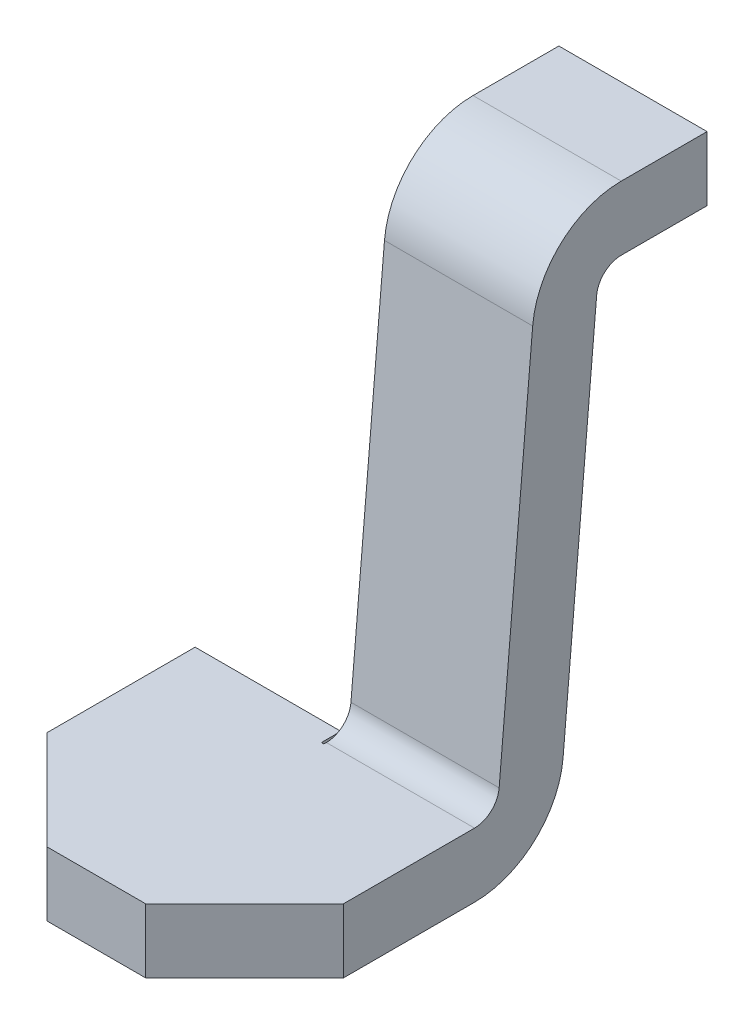
ISO-10303-21;
HEADER;
FILE_DESCRIPTION(('STEP AP214'),'2;1');
FILE_NAME('part.step','',(''),(''),'','','');
FILE_SCHEMA(('AUTOMOTIVE_DESIGN { 1 0 10303 214 1 1 1 1 }'));
ENDSEC;
DATA;
#1=APPLICATION_CONTEXT('core data for automotive mechanical design processes');
#2=APPLICATION_PROTOCOL_DEFINITION('international standard','automotive_design',2000,#1);
#3=PRODUCT_CONTEXT('',#1,'mechanical');
#4=PRODUCT('Part','Part','',(#3));
#5=PRODUCT_RELATED_PRODUCT_CATEGORY('part','',(#4));
#6=PRODUCT_DEFINITION_FORMATION('','',#4);
#7=PRODUCT_DEFINITION_CONTEXT('part definition',#1,'design');
#8=PRODUCT_DEFINITION('design','',#6,#7);
#9=PRODUCT_DEFINITION_SHAPE('','',#8);
#10=(LENGTH_UNIT() NAMED_UNIT(*) SI_UNIT(.MILLI.,.METRE.));
#11=(NAMED_UNIT(*) PLANE_ANGLE_UNIT() SI_UNIT($,.RADIAN.));
#12=(NAMED_UNIT(*) SI_UNIT($,.STERADIAN.) SOLID_ANGLE_UNIT());
#13=UNCERTAINTY_MEASURE_WITH_UNIT(LENGTH_MEASURE(1.E-05),#10,'distance_accuracy_value','');
#14=(GEOMETRIC_REPRESENTATION_CONTEXT(3) GLOBAL_UNCERTAINTY_ASSIGNED_CONTEXT((#13)) GLOBAL_UNIT_ASSIGNED_CONTEXT((#10,
#11,#12)) REPRESENTATION_CONTEXT('',''));
#15=CARTESIAN_POINT('',(0.,0.,0.));
#16=DIRECTION('',(0.,0.,1.));
#17=DIRECTION('',(1.,0.,0.));
#18=AXIS2_PLACEMENT_3D('',#15,#16,#17);
#19=CARTESIAN_POINT('',(12.295244141329,0.26,4.351100996136));
#20=DIRECTION('',(1.,0.,0.));
#21=DIRECTION('',(0.,0.,-1.));
#22=AXIS2_PLACEMENT_3D('',#19,#20,#21);
#23=PLANE('',#22);
#24=DIRECTION('',(0.,1.,0.));
#25=VECTOR('',#24,1.);
#26=CARTESIAN_POINT('',(12.295244141329,0.26,4.351100996136));
#27=LINE('',#26,#25);
#28=CARTESIAN_POINT('',(12.295244141329,0.26,4.351100996136));
#29=VERTEX_POINT('',#28);
#30=CARTESIAN_POINT('',(12.295244141329,0.,4.351100996136));
#31=VERTEX_POINT('',#30);
#32=EDGE_CURVE('E142',#29,#31,#27,.F.);
#33=ORIENTED_EDGE('',*,*,#32,.F.);
#34=DIRECTION('',(0.,0.,-1.));
#35=VECTOR('',#34,1.);
#36=CARTESIAN_POINT('',(12.295244141329,0.26,4.351100996136));
#37=LINE('',#36,#35);
#38=CARTESIAN_POINT('',(12.295244141329,0.26,4.341100996136));
#39=VERTEX_POINT('',#38);
#40=EDGE_CURVE('E108',#39,#29,#37,.F.);
#41=ORIENTED_EDGE('',*,*,#40,.F.);
#42=CARTESIAN_POINT('',(12.295244141329,0.36,4.341100996136));
#43=DIRECTION('',(1.,0.,0.));
#44=DIRECTION('',(0.,0.,-1.));
#45=AXIS2_PLACEMENT_3D('',#42,#43,#44);
#46=CIRCLE('',#45,0.1);
#47=CARTESIAN_POINT('',(12.295244141329,0.351284425725095,4.24148152632665));
#48=VERTEX_POINT('',#47);
#49=EDGE_CURVE('E20',#48,#39,#46,.F.);
#50=ORIENTED_EDGE('',*,*,#49,.F.);
#51=DIRECTION('',(0.,-0.996194698091747,0.0871557427476379));
#52=VECTOR('',#51,1.);
#53=CARTESIAN_POINT('',(12.295244141329,0.985734653762,4.185974323802));
#54=LINE('',#53,#52);
#55=CARTESIAN_POINT('',(12.295244141329,1.90284537491301,4.10573753250322));
#56=VERTEX_POINT('',#55);
#57=EDGE_CURVE('E105',#56,#48,#54,.T.);
#58=ORIENTED_EDGE('',*,*,#57,.F.);
#59=CARTESIAN_POINT('',(12.295244141329,1.871469307524,3.747107441191));
#60=DIRECTION('',(-1.,0.,0.));
#61=DIRECTION('',(0.,0.,1.));
#62=AXIS2_PLACEMENT_3D('',#59,#60,#61);
#63=CIRCLE('',#62,0.36);
#64=CARTESIAN_POINT('',(12.295244141329,2.231469307524,3.747107441191));
#65=VERTEX_POINT('',#64);
#66=EDGE_CURVE('E98',#65,#56,#63,.F.);
#67=ORIENTED_EDGE('',*,*,#66,.F.);
#68=DIRECTION('',(0.,0.,1.));
#69=VECTOR('',#68,1.);
#70=CARTESIAN_POINT('',(12.295244141329,2.231469307524,3.749733716354));
#71=LINE('',#70,#69);
#72=CARTESIAN_POINT('',(12.295244141329,2.231469307524,3.399733716354));
#73=VERTEX_POINT('',#72);
#74=EDGE_CURVE('E120',#73,#65,#71,.T.);
#75=ORIENTED_EDGE('',*,*,#74,.F.);
#76=DIRECTION('',(0.,1.,0.));
#77=VECTOR('',#76,1.);
#78=CARTESIAN_POINT('',(12.295244141329,1.971469307524,3.399733716354));
#79=LINE('',#78,#77);
#80=CARTESIAN_POINT('',(12.295244141329,1.971469307524,3.399733716354));
#81=VERTEX_POINT('',#80);
#82=EDGE_CURVE('E126',#81,#73,#79,.T.);
#83=ORIENTED_EDGE('',*,*,#82,.F.);
#84=DIRECTION('',(0.,0.,1.));
#85=VECTOR('',#84,1.);
#86=CARTESIAN_POINT('',(12.295244141329,1.971469307524,3.749733716354));
#87=LINE('',#86,#85);
#88=CARTESIAN_POINT('',(12.295244141329,1.971469307524,3.747107441191));
#89=VERTEX_POINT('',#88);
#90=EDGE_CURVE('E132',#81,#89,#87,.T.);
#91=ORIENTED_EDGE('',*,*,#90,.T.);
#92=CARTESIAN_POINT('',(12.295244141329,1.871469307524,3.747107441191));
#93=DIRECTION('',(-1.,0.,0.));
#94=DIRECTION('',(0.,0.,1.));
#95=AXIS2_PLACEMENT_3D('',#92,#93,#94);
#96=CIRCLE('',#95,0.1);
#97=CARTESIAN_POINT('',(12.295244141329,1.88018488179839,3.8467269110002));
#98=VERTEX_POINT('',#97);
#99=EDGE_CURVE('E165',#89,#98,#96,.F.);
#100=ORIENTED_EDGE('',*,*,#99,.T.);
#101=DIRECTION('',(0.,-0.996194698091747,0.0871557427476379));
#102=VECTOR('',#101,1.);
#103=CARTESIAN_POINT('',(12.295244141329,0.963074160647,3.926963702299));
#104=LINE('',#103,#102);
#105=CARTESIAN_POINT('',(12.295244141329,0.328623932610977,3.98247090482358));
#106=VERTEX_POINT('',#105);
#107=EDGE_CURVE('E138',#98,#106,#104,.T.);
#108=ORIENTED_EDGE('',*,*,#107,.T.);
#109=CARTESIAN_POINT('',(12.295244141329,0.36,4.341100996136));
#110=DIRECTION('',(1.,0.,0.));
#111=DIRECTION('',(0.,0.,-1.));
#112=AXIS2_PLACEMENT_3D('',#109,#110,#111);
#113=CIRCLE('',#112,0.36);
#114=CARTESIAN_POINT('',(12.295244141329,0.,4.341100996136));
#115=VERTEX_POINT('',#114);
#116=EDGE_CURVE('E141',#115,#106,#113,.T.);
#117=ORIENTED_EDGE('',*,*,#116,.F.);
#118=DIRECTION('',(0.,0.,1.));
#119=VECTOR('',#118,1.);
#120=CARTESIAN_POINT('',(12.295244141329,0.,4.772214931251));
#121=LINE('',#120,#119);
#122=EDGE_CURVE('E145',#115,#31,#121,.T.);
#123=ORIENTED_EDGE('',*,*,#122,.T.);
#124=EDGE_LOOP('',(#33,#41,#50,#58,#67,#75,#83,#91,#100,#108,#117,#123));
#125=FACE_BOUND('',#124,.T.);
#126=ADVANCED_FACE('F17',(#125),#23,.F.);
#127=CARTESIAN_POINT('',(12.295244141329,0.,4.772214931251));
#128=DIRECTION('',(0.,1.,0.));
#129=DIRECTION('',(0.,0.,1.));
#130=AXIS2_PLACEMENT_3D('',#127,#128,#129);
#131=PLANE('',#130);
#132=ORIENTED_EDGE('',*,*,#122,.F.);
#133=DIRECTION('',(1.,0.,0.));
#134=VECTOR('',#133,1.);
#135=CARTESIAN_POINT('',(12.595244141329,0.,4.341100996136));
#136=LINE('',#135,#134);
#137=CARTESIAN_POINT('',(12.895244141329,0.,4.341100996136));
#138=VERTEX_POINT('',#137);
#139=EDGE_CURVE('E168',#138,#115,#136,.F.);
#140=ORIENTED_EDGE('',*,*,#139,.F.);
#141=DIRECTION('',(0.,0.,-1.));
#142=VECTOR('',#141,1.);
#143=CARTESIAN_POINT('',(12.895244141329,0.,4.272214931251));
#144=LINE('',#143,#142);
#145=CARTESIAN_POINT('',(12.895244141329,0.,4.872214931251));
#146=VERTEX_POINT('',#145);
#147=EDGE_CURVE('E163',#146,#138,#144,.T.);
#148=ORIENTED_EDGE('',*,*,#147,.F.);
#149=DIRECTION('',(0.707106781186548,0.,-0.707106781186548));
#150=VECTOR('',#149,1.);
#151=CARTESIAN_POINT('',(12.695244141329,0.,5.072214931251));
#152=LINE('',#151,#150);
#153=CARTESIAN_POINT('',(12.495244141329,0.,5.272214931251));
#154=VERTEX_POINT('',#153);
#155=EDGE_CURVE('E180',#154,#146,#152,.T.);
#156=ORIENTED_EDGE('',*,*,#155,.F.);
#157=DIRECTION('',(1.,0.,0.));
#158=VECTOR('',#157,1.);
#159=CARTESIAN_POINT('',(12.895244141329,0.,5.272214931251));
#160=LINE('',#159,#158);
#161=CARTESIAN_POINT('',(12.095244141329,0.,5.272214931251));
#162=VERTEX_POINT('',#161);
#163=EDGE_CURVE('E184',#162,#154,#160,.T.);
#164=ORIENTED_EDGE('',*,*,#163,.F.);
#165=DIRECTION('',(0.707106781186548,0.,0.707106781186548));
#166=VECTOR('',#165,1.);
#167=CARTESIAN_POINT('',(11.895244141329,0.,5.072214931251));
#168=LINE('',#167,#166);
#169=CARTESIAN_POINT('',(11.695244141329,0.,4.872214931251));
#170=VERTEX_POINT('',#169);
#171=EDGE_CURVE('E192',#170,#162,#168,.T.);
#172=ORIENTED_EDGE('',*,*,#171,.F.);
#173=DIRECTION('',(0.,0.,1.));
#174=VECTOR('',#173,1.);
#175=CARTESIAN_POINT('',(11.695244141329,0.,5.272214931251));
#176=LINE('',#175,#174);
#177=CARTESIAN_POINT('',(11.695244141329,0.,4.272214931251));
#178=VERTEX_POINT('',#177);
#179=EDGE_CURVE('E196',#178,#170,#176,.T.);
#180=ORIENTED_EDGE('',*,*,#179,.F.);
#181=DIRECTION('',(-1.,0.,0.));
#182=VECTOR('',#181,1.);
#183=CARTESIAN_POINT('',(11.695244141329,0.,4.272214931251));
#184=LINE('',#183,#182);
#185=CARTESIAN_POINT('',(12.285244141329,0.,4.272214931251));
#186=VERTEX_POINT('',#185);
#187=EDGE_CURVE('E204',#186,#178,#184,.T.);
#188=ORIENTED_EDGE('',*,*,#187,.F.);
#189=DIRECTION('',(0.,0.,1.));
#190=VECTOR('',#189,1.);
#191=CARTESIAN_POINT('',(12.285244141329,0.,4.272214931251));
#192=LINE('',#191,#190);
#193=CARTESIAN_POINT('',(12.285244141329,0.,4.351100996136));
#194=VERTEX_POINT('',#193);
#195=EDGE_CURVE('E113',#186,#194,#192,.T.);
#196=ORIENTED_EDGE('',*,*,#195,.T.);
#197=DIRECTION('',(1.,0.,0.));
#198=VECTOR('',#197,1.);
#199=CARTESIAN_POINT('',(12.285244141329,0.,4.351100996136));
#200=LINE('',#199,#198);
#201=EDGE_CURVE('E110',#194,#31,#200,.T.);
#202=ORIENTED_EDGE('',*,*,#201,.T.);
#203=EDGE_LOOP('',(#132,#140,#148,#156,#164,#172,#180,#188,#196,#202));
#204=FACE_BOUND('',#203,.T.);
#205=ADVANCED_FACE('F236',(#204),#131,.F.);
#206=CARTESIAN_POINT('',(12.595244141329,0.36,4.341100996136));
#207=DIRECTION('',(1.,0.,0.));
#208=DIRECTION('',(0.,0.,-1.));
#209=AXIS2_PLACEMENT_3D('',#206,#207,#208);
#210=CYLINDRICAL_SURFACE('',#209,0.36);
#211=DIRECTION('',(1.,0.,0.));
#212=VECTOR('',#211,1.);
#213=CARTESIAN_POINT('',(12.595244141329,0.32862393261105,3.98247090482357));
#214=LINE('',#213,#212);
#215=CARTESIAN_POINT('',(12.895244141329,0.328623932610992,3.98247090482329));
#216=VERTEX_POINT('',#215);
#217=EDGE_CURVE('E140',#106,#216,#214,.T.);
#218=ORIENTED_EDGE('',*,*,#217,.T.);
#219=CARTESIAN_POINT('',(12.895244141329,0.36,4.341100996136));
#220=DIRECTION('',(1.,0.,0.));
#221=DIRECTION('',(0.,0.,-1.));
#222=AXIS2_PLACEMENT_3D('',#219,#220,#221);
#223=CIRCLE('',#222,0.36);
#224=EDGE_CURVE('E160',#138,#216,#223,.T.);
#225=ORIENTED_EDGE('',*,*,#224,.F.);
#226=ORIENTED_EDGE('',*,*,#139,.T.);
#227=ORIENTED_EDGE('',*,*,#116,.T.);
#228=EDGE_LOOP('',(#218,#225,#226,#227));
#229=FACE_BOUND('',#228,.T.);
#230=ADVANCED_FACE('F556',(#229),#210,.T.);
#231=CARTESIAN_POINT('',(12.595244141329,0.963074160647,3.926963702299));
#232=DIRECTION('',(0.,0.0871557427476379,0.996194698091747));
#233=DIRECTION('',(0.,-0.996194698091747,0.0871557427476379));
#234=AXIS2_PLACEMENT_3D('',#231,#232,#233);
#235=PLANE('',#234);
#236=ORIENTED_EDGE('',*,*,#217,.F.);
#237=ORIENTED_EDGE('',*,*,#107,.F.);
#238=DIRECTION('',(-1.,0.,0.));
#239=VECTOR('',#238,1.);
#240=CARTESIAN_POINT('',(12.595244141329,1.88018488179802,3.84672691100024));
#241=LINE('',#240,#239);
#242=CARTESIAN_POINT('',(12.895244141329,1.88018488179837,3.84672691100009));
#243=VERTEX_POINT('',#242);
#244=EDGE_CURVE('E166',#98,#243,#241,.F.);
#245=ORIENTED_EDGE('',*,*,#244,.T.);
#246=DIRECTION('',(0.,0.996194698091767,-0.0871557427474127));
#247=VECTOR('',#246,1.);
#248=CARTESIAN_POINT('',(12.895244141329,0.328623932611,3.982470904823));
#249=LINE('',#248,#247);
#250=EDGE_CURVE('E159',#216,#243,#249,.T.);
#251=ORIENTED_EDGE('',*,*,#250,.F.);
#252=EDGE_LOOP('',(#236,#237,#245,#251));
#253=FACE_BOUND('',#252,.T.);
#254=ADVANCED_FACE('F275',(#253),#235,.F.);
#255=CARTESIAN_POINT('',(12.595244141329,1.871469307524,3.747107441191));
#256=DIRECTION('',(-1.,0.,0.));
#257=DIRECTION('',(0.,0.,1.));
#258=AXIS2_PLACEMENT_3D('',#255,#256,#257);
#259=CYLINDRICAL_SURFACE('',#258,0.1);
#260=ORIENTED_EDGE('',*,*,#244,.F.);
#261=ORIENTED_EDGE('',*,*,#99,.F.);
#262=DIRECTION('',(1.,0.,0.));
#263=VECTOR('',#262,1.);
#264=CARTESIAN_POINT('',(12.595244141329,1.971469307524,3.747107441191));
#265=LINE('',#264,#263);
#266=CARTESIAN_POINT('',(12.895244141329,1.971469307524,3.747107441191));
#267=VERTEX_POINT('',#266);
#268=EDGE_CURVE('E135',#89,#267,#265,.T.);
#269=ORIENTED_EDGE('',*,*,#268,.T.);
#270=CARTESIAN_POINT('',(12.895244141329,1.871469307524,3.747107441191));
#271=DIRECTION('',(-1.,0.,0.));
#272=DIRECTION('',(0.,0.,1.));
#273=AXIS2_PLACEMENT_3D('',#270,#271,#272);
#274=CIRCLE('',#273,0.1);
#275=EDGE_CURVE('E155',#243,#267,#274,.T.);
#276=ORIENTED_EDGE('',*,*,#275,.F.);
#277=EDGE_LOOP('',(#260,#261,#269,#276));
#278=FACE_BOUND('',#277,.T.);
#279=ADVANCED_FACE('F278',(#278),#259,.F.);
#280=CARTESIAN_POINT('',(12.595244141329,1.971469307524,3.749733716354));
#281=DIRECTION('',(0.,1.,0.));
#282=DIRECTION('',(0.,0.,1.));
#283=AXIS2_PLACEMENT_3D('',#280,#281,#282);
#284=PLANE('',#283);
#285=DIRECTION('',(-1.,0.,0.));
#286=VECTOR('',#285,1.);
#287=CARTESIAN_POINT('',(12.295244141329,1.971469307524,3.399733716354));
#288=LINE('',#287,#286);
#289=CARTESIAN_POINT('',(12.895244141329,1.971469307524,3.399733716354));
#290=VERTEX_POINT('',#289);
#291=EDGE_CURVE('E129',#290,#81,#288,.T.);
#292=ORIENTED_EDGE('',*,*,#291,.F.);
#293=DIRECTION('',(0.,0.,-1.));
#294=VECTOR('',#293,1.);
#295=CARTESIAN_POINT('',(12.895244141329,1.971469307524,4.272214931251));
#296=LINE('',#295,#294);
#297=EDGE_CURVE('E158',#267,#290,#296,.T.);
#298=ORIENTED_EDGE('',*,*,#297,.F.);
#299=ORIENTED_EDGE('',*,*,#268,.F.);
#300=ORIENTED_EDGE('',*,*,#90,.F.);
#301=EDGE_LOOP('',(#292,#298,#299,#300));
#302=FACE_BOUND('',#301,.T.);
#303=ADVANCED_FACE('F362',(#302),#284,.F.);
#304=CARTESIAN_POINT('',(12.295244141329,1.971469307524,3.399733716354));
#305=DIRECTION('',(0.,0.,-1.));
#306=DIRECTION('',(-1.,0.,0.));
#307=AXIS2_PLACEMENT_3D('',#304,#305,#306);
#308=PLANE('',#307);
#309=DIRECTION('',(1.,0.,0.));
#310=VECTOR('',#309,1.);
#311=CARTESIAN_POINT('',(12.595244141329,2.231469307524,3.399733716354));
#312=LINE('',#311,#310);
#313=CARTESIAN_POINT('',(12.895244141329,2.231469307524,3.399733716354));
#314=VERTEX_POINT('',#313);
#315=EDGE_CURVE('E123',#314,#73,#312,.F.);
#316=ORIENTED_EDGE('',*,*,#315,.F.);
#317=DIRECTION('',(0.,1.,0.));
#318=VECTOR('',#317,1.);
#319=CARTESIAN_POINT('',(12.895244141329,0.,3.399733716354));
#320=LINE('',#319,#318);
#321=EDGE_CURVE('E261',#290,#314,#320,.T.);
#322=ORIENTED_EDGE('',*,*,#321,.F.);
#323=ORIENTED_EDGE('',*,*,#291,.T.);
#324=ORIENTED_EDGE('',*,*,#82,.T.);
#325=EDGE_LOOP('',(#316,#322,#323,#324));
#326=FACE_BOUND('',#325,.T.);
#327=ADVANCED_FACE('F366',(#326),#308,.T.);
#328=CARTESIAN_POINT('',(12.595244141329,2.231469307524,3.749733716354));
#329=DIRECTION('',(0.,1.,0.));
#330=DIRECTION('',(0.,0.,1.));
#331=AXIS2_PLACEMENT_3D('',#328,#329,#330);
#332=PLANE('',#331);
#333=DIRECTION('',(-1.,0.,0.));
#334=VECTOR('',#333,1.);
#335=CARTESIAN_POINT('',(12.595244141329,2.231469307524,3.747107441191));
#336=LINE('',#335,#334);
#337=CARTESIAN_POINT('',(12.895244141329,2.231469307524,3.747107441191));
#338=VERTEX_POINT('',#337);
#339=EDGE_CURVE('E122',#338,#65,#336,.T.);
#340=ORIENTED_EDGE('',*,*,#339,.F.);
#341=DIRECTION('',(0.,0.,-1.));
#342=VECTOR('',#341,1.);
#343=CARTESIAN_POINT('',(12.895244141329,2.231469307524,4.272214931251));
#344=LINE('',#343,#342);
#345=EDGE_CURVE('E154',#314,#338,#344,.F.);
#346=ORIENTED_EDGE('',*,*,#345,.F.);
#347=ORIENTED_EDGE('',*,*,#315,.T.);
#348=ORIENTED_EDGE('',*,*,#74,.T.);
#349=EDGE_LOOP('',(#340,#346,#347,#348));
#350=FACE_BOUND('',#349,.T.);
#351=ADVANCED_FACE('F377',(#350),#332,.T.);
#352=CARTESIAN_POINT('',(12.595244141329,1.871469307524,3.747107441191));
#353=DIRECTION('',(-1.,0.,0.));
#354=DIRECTION('',(0.,0.,1.));
#355=AXIS2_PLACEMENT_3D('',#352,#353,#354);
#356=CYLINDRICAL_SURFACE('',#355,0.36);
#357=ORIENTED_EDGE('',*,*,#339,.T.);
#358=ORIENTED_EDGE('',*,*,#66,.T.);
#359=DIRECTION('',(1.,0.,0.));
#360=VECTOR('',#359,1.);
#361=CARTESIAN_POINT('',(12.595244141329,1.90284537491293,4.10573753250323));
#362=LINE('',#361,#360);
#363=CARTESIAN_POINT('',(12.895244141329,1.90284537491299,4.10573753250361));
#364=VERTEX_POINT('',#363);
#365=EDGE_CURVE('E97',#364,#56,#362,.F.);
#366=ORIENTED_EDGE('',*,*,#365,.F.);
#367=CARTESIAN_POINT('',(12.895244141329,1.871469307524,3.747107441191));
#368=DIRECTION('',(-1.,0.,0.));
#369=DIRECTION('',(0.,0.,1.));
#370=AXIS2_PLACEMENT_3D('',#367,#368,#369);
#371=CIRCLE('',#370,0.36);
#372=EDGE_CURVE('E151',#338,#364,#371,.F.);
#373=ORIENTED_EDGE('',*,*,#372,.F.);
#374=EDGE_LOOP('',(#357,#358,#366,#373));
#375=FACE_BOUND('',#374,.T.);
#376=ADVANCED_FACE('F375',(#375),#356,.T.);
#377=CARTESIAN_POINT('',(12.595244141329,0.985734653762,4.185974323802));
#378=DIRECTION('',(0.,0.0871557427476379,0.996194698091747));
#379=DIRECTION('',(0.,-0.996194698091747,0.0871557427476379));
#380=AXIS2_PLACEMENT_3D('',#377,#378,#379);
#381=PLANE('',#380);
#382=ORIENTED_EDGE('',*,*,#365,.T.);
#383=ORIENTED_EDGE('',*,*,#57,.T.);
#384=DIRECTION('',(1.,0.,0.));
#385=VECTOR('',#384,1.);
#386=CARTESIAN_POINT('',(12.595244141329,0.351284425724971,4.24148152632666));
#387=LINE('',#386,#385);
#388=CARTESIAN_POINT('',(12.895244141329,0.351284425725124,4.24148152632682));
#389=VERTEX_POINT('',#388);
#390=EDGE_CURVE('E91',#48,#389,#387,.T.);
#391=ORIENTED_EDGE('',*,*,#390,.T.);
#392=DIRECTION('',(0.,-0.996194698091772,0.0871557427473569));
#393=VECTOR('',#392,1.);
#394=CARTESIAN_POINT('',(12.895244141329,1.902845374913,4.105737532504));
#395=LINE('',#394,#393);
#396=EDGE_CURVE('E150',#364,#389,#395,.T.);
#397=ORIENTED_EDGE('',*,*,#396,.F.);
#398=EDGE_LOOP('',(#382,#383,#391,#397));
#399=FACE_BOUND('',#398,.T.);
#400=ADVANCED_FACE('F109',(#399),#381,.T.);
#401=CARTESIAN_POINT('',(12.285244141329,0.26,4.351100996136));
#402=DIRECTION('',(0.,0.,1.));
#403=DIRECTION('',(1.,0.,0.));
#404=AXIS2_PLACEMENT_3D('',#401,#402,#403);
#405=PLANE('',#404);
#406=DIRECTION('',(1.,0.,0.));
#407=VECTOR('',#406,1.);
#408=CARTESIAN_POINT('',(12.295244141329,0.26,4.351100996136));
#409=LINE('',#408,#407);
#410=CARTESIAN_POINT('',(12.285244141329,0.26,4.351100996136));
#411=VERTEX_POINT('',#410);
#412=EDGE_CURVE('E149',#29,#411,#409,.F.);
#413=ORIENTED_EDGE('',*,*,#412,.F.);
#414=ORIENTED_EDGE('',*,*,#32,.T.);
#415=ORIENTED_EDGE('',*,*,#201,.F.);
#416=DIRECTION('',(0.,1.,0.));
#417=VECTOR('',#416,1.);
#418=CARTESIAN_POINT('',(12.285244141329,0.26,4.351100996136));
#419=LINE('',#418,#417);
#420=EDGE_CURVE('E212',#194,#411,#419,.T.);
#421=ORIENTED_EDGE('',*,*,#420,.T.);
#422=EDGE_LOOP('',(#413,#414,#415,#421));
#423=FACE_BOUND('',#422,.T.);
#424=ADVANCED_FACE('F227',(#423),#405,.F.);
#425=CARTESIAN_POINT('',(12.285244141329,0.26,4.272214931251));
#426=DIRECTION('',(-1.,0.,0.));
#427=DIRECTION('',(0.,0.,1.));
#428=AXIS2_PLACEMENT_3D('',#425,#426,#427);
#429=PLANE('',#428);
#430=DIRECTION('',(0.,0.,1.));
#431=VECTOR('',#430,1.);
#432=CARTESIAN_POINT('',(12.285244141329,0.26,4.772214931251));
#433=LINE('',#432,#431);
#434=CARTESIAN_POINT('',(12.285244141329,0.26,4.272214931251));
#435=VERTEX_POINT('',#434);
#436=EDGE_CURVE('E231',#411,#435,#433,.F.);
#437=ORIENTED_EDGE('',*,*,#436,.F.);
#438=ORIENTED_EDGE('',*,*,#420,.F.);
#439=ORIENTED_EDGE('',*,*,#195,.F.);
#440=DIRECTION('',(0.,1.,0.));
#441=VECTOR('',#440,1.);
#442=CARTESIAN_POINT('',(12.285244141329,0.,4.272214931251));
#443=LINE('',#442,#441);
#444=EDGE_CURVE('E207',#435,#186,#443,.F.);
#445=ORIENTED_EDGE('',*,*,#444,.F.);
#446=EDGE_LOOP('',(#437,#438,#439,#445));
#447=FACE_BOUND('',#446,.T.);
#448=ADVANCED_FACE('F242',(#447),#429,.F.);
#449=CARTESIAN_POINT('',(11.695244141329,0.,4.272214931251));
#450=DIRECTION('',(0.,0.,-1.));
#451=DIRECTION('',(-1.,0.,0.));
#452=AXIS2_PLACEMENT_3D('',#449,#450,#451);
#453=PLANE('',#452);
#454=ORIENTED_EDGE('',*,*,#444,.T.);
#455=ORIENTED_EDGE('',*,*,#187,.T.);
#456=DIRECTION('',(0.,1.,0.));
#457=VECTOR('',#456,1.);
#458=CARTESIAN_POINT('',(11.695244141329,0.,4.272214931251));
#459=LINE('',#458,#457);
#460=CARTESIAN_POINT('',(11.695244141329,0.26,4.272214931251));
#461=VERTEX_POINT('',#460);
#462=EDGE_CURVE('E201',#461,#178,#459,.F.);
#463=ORIENTED_EDGE('',*,*,#462,.F.);
#464=DIRECTION('',(1.,0.,0.));
#465=VECTOR('',#464,1.);
#466=CARTESIAN_POINT('',(12.295244141329,0.26,4.272214931251));
#467=LINE('',#466,#465);
#468=EDGE_CURVE('E330',#435,#461,#467,.F.);
#469=ORIENTED_EDGE('',*,*,#468,.F.);
#470=EDGE_LOOP('',(#454,#455,#463,#469));
#471=FACE_BOUND('',#470,.T.);
#472=ADVANCED_FACE('F411',(#471),#453,.T.);
#473=CARTESIAN_POINT('',(11.695244141329,0.,5.272214931251));
#474=DIRECTION('',(-1.,0.,0.));
#475=DIRECTION('',(0.,0.,1.));
#476=AXIS2_PLACEMENT_3D('',#473,#474,#475);
#477=PLANE('',#476);
#478=DIRECTION('',(0.,1.,0.));
#479=VECTOR('',#478,1.);
#480=CARTESIAN_POINT('',(11.695244141329,0.,4.872214931251));
#481=LINE('',#480,#479);
#482=CARTESIAN_POINT('',(11.695244141329,0.26,4.872214931251));
#483=VERTEX_POINT('',#482);
#484=EDGE_CURVE('E195',#483,#170,#481,.F.);
#485=ORIENTED_EDGE('',*,*,#484,.F.);
#486=DIRECTION('',(0.,0.,1.));
#487=VECTOR('',#486,1.);
#488=CARTESIAN_POINT('',(11.695244141329,0.26,4.772214931251));
#489=LINE('',#488,#487);
#490=EDGE_CURVE('E321',#461,#483,#489,.T.);
#491=ORIENTED_EDGE('',*,*,#490,.F.);
#492=ORIENTED_EDGE('',*,*,#462,.T.);
#493=ORIENTED_EDGE('',*,*,#179,.T.);
#494=EDGE_LOOP('',(#485,#491,#492,#493));
#495=FACE_BOUND('',#494,.T.);
#496=ADVANCED_FACE('F407',(#495),#477,.T.);
#497=CARTESIAN_POINT('',(11.895244141329,0.,5.072214931251));
#498=DIRECTION('',(-0.707106781186548,0.,0.707106781186548));
#499=DIRECTION('',(0.707106781186548,0.,0.707106781186548));
#500=AXIS2_PLACEMENT_3D('',#497,#498,#499);
#501=PLANE('',#500);
#502=DIRECTION('',(0.707106781186547,0.,0.707106781186547));
#503=VECTOR('',#502,1.);
#504=CARTESIAN_POINT('',(11.695244141329,0.26,4.872214931251));
#505=LINE('',#504,#503);
#506=CARTESIAN_POINT('',(12.095244141329,0.26,5.272214931251));
#507=VERTEX_POINT('',#506);
#508=EDGE_CURVE('E312',#483,#507,#505,.T.);
#509=ORIENTED_EDGE('',*,*,#508,.F.);
#510=ORIENTED_EDGE('',*,*,#484,.T.);
#511=ORIENTED_EDGE('',*,*,#171,.T.);
#512=DIRECTION('',(0.,1.,0.));
#513=VECTOR('',#512,1.);
#514=CARTESIAN_POINT('',(12.095244141329,0.,5.272214931251));
#515=LINE('',#514,#513);
#516=EDGE_CURVE('E189',#507,#162,#515,.F.);
#517=ORIENTED_EDGE('',*,*,#516,.F.);
#518=EDGE_LOOP('',(#509,#510,#511,#517));
#519=FACE_BOUND('',#518,.T.);
#520=ADVANCED_FACE('F403',(#519),#501,.T.);
#521=CARTESIAN_POINT('',(12.895244141329,0.,5.272214931251));
#522=DIRECTION('',(0.,0.,1.));
#523=DIRECTION('',(1.,0.,0.));
#524=AXIS2_PLACEMENT_3D('',#521,#522,#523);
#525=PLANE('',#524);
#526=DIRECTION('',(0.,1.,0.));
#527=VECTOR('',#526,1.);
#528=CARTESIAN_POINT('',(12.495244141329,0.,5.272214931251));
#529=LINE('',#528,#527);
#530=CARTESIAN_POINT('',(12.495244141329,0.26,5.272214931251));
#531=VERTEX_POINT('',#530);
#532=EDGE_CURVE('E183',#531,#154,#529,.F.);
#533=ORIENTED_EDGE('',*,*,#532,.F.);
#534=DIRECTION('',(1.,0.,0.));
#535=VECTOR('',#534,1.);
#536=CARTESIAN_POINT('',(12.295244141329,0.26,5.272214931251));
#537=LINE('',#536,#535);
#538=EDGE_CURVE('E303',#507,#531,#537,.T.);
#539=ORIENTED_EDGE('',*,*,#538,.F.);
#540=ORIENTED_EDGE('',*,*,#516,.T.);
#541=ORIENTED_EDGE('',*,*,#163,.T.);
#542=EDGE_LOOP('',(#533,#539,#540,#541));
#543=FACE_BOUND('',#542,.T.);
#544=ADVANCED_FACE('F399',(#543),#525,.T.);
#545=CARTESIAN_POINT('',(12.695244141329,0.,5.072214931251));
#546=DIRECTION('',(0.707106781186548,0.,0.707106781186548));
#547=DIRECTION('',(0.707106781186548,0.,-0.707106781186548));
#548=AXIS2_PLACEMENT_3D('',#545,#546,#547);
#549=PLANE('',#548);
#550=DIRECTION('',(0.707106781186549,0.,-0.707106781186546));
#551=VECTOR('',#550,1.);
#552=CARTESIAN_POINT('',(12.495244141329,0.26,5.272214931251));
#553=LINE('',#552,#551);
#554=CARTESIAN_POINT('',(12.895244141329,0.26,4.872214931251));
#555=VERTEX_POINT('',#554);
#556=EDGE_CURVE('E294',#531,#555,#553,.T.);
#557=ORIENTED_EDGE('',*,*,#556,.F.);
#558=ORIENTED_EDGE('',*,*,#532,.T.);
#559=ORIENTED_EDGE('',*,*,#155,.T.);
#560=DIRECTION('',(0.,1.,0.));
#561=VECTOR('',#560,1.);
#562=CARTESIAN_POINT('',(12.895244141329,0.,4.872214931251));
#563=LINE('',#562,#561);
#564=EDGE_CURVE('E290',#555,#146,#563,.F.);
#565=ORIENTED_EDGE('',*,*,#564,.F.);
#566=EDGE_LOOP('',(#557,#558,#559,#565));
#567=FACE_BOUND('',#566,.T.);
#568=ADVANCED_FACE('F396',(#567),#549,.T.);
#569=CARTESIAN_POINT('',(12.895244141329,0.,4.272214931251));
#570=DIRECTION('',(1.,0.,0.));
#571=DIRECTION('',(0.,0.,-1.));
#572=AXIS2_PLACEMENT_3D('',#569,#570,#571);
#573=PLANE('',#572);
#574=CARTESIAN_POINT('',(12.895244141329,0.36,4.341100996136));
#575=DIRECTION('',(1.,0.,0.));
#576=DIRECTION('',(0.,0.,-1.));
#577=AXIS2_PLACEMENT_3D('',#574,#575,#576);
#578=CIRCLE('',#577,0.1);
#579=CARTESIAN_POINT('',(12.895244141329,0.26,4.341100996136));
#580=VERTEX_POINT('',#579);
#581=EDGE_CURVE('E35',#389,#580,#578,.F.);
#582=ORIENTED_EDGE('',*,*,#581,.T.);
#583=DIRECTION('',(0.,0.,1.));
#584=VECTOR('',#583,1.);
#585=CARTESIAN_POINT('',(12.895244141329,0.26,4.772214931251));
#586=LINE('',#585,#584);
#587=EDGE_CURVE('E26',#555,#580,#586,.F.);
#588=ORIENTED_EDGE('',*,*,#587,.F.);
#589=ORIENTED_EDGE('',*,*,#564,.T.);
#590=ORIENTED_EDGE('',*,*,#147,.T.);
#591=ORIENTED_EDGE('',*,*,#224,.T.);
#592=ORIENTED_EDGE('',*,*,#250,.T.);
#593=ORIENTED_EDGE('',*,*,#275,.T.);
#594=ORIENTED_EDGE('',*,*,#297,.T.);
#595=ORIENTED_EDGE('',*,*,#321,.T.);
#596=ORIENTED_EDGE('',*,*,#345,.T.);
#597=ORIENTED_EDGE('',*,*,#372,.T.);
#598=ORIENTED_EDGE('',*,*,#396,.T.);
#599=EDGE_LOOP('',(#582,#588,#589,#590,#591,#592,#593,#594,#595,#596,#597,#598));
#600=FACE_BOUND('',#599,.T.);
#601=ADVANCED_FACE('F282',(#600),#573,.T.);
#602=CARTESIAN_POINT('',(12.595244141329,0.36,4.341100996136));
#603=DIRECTION('',(1.,0.,0.));
#604=DIRECTION('',(0.,0.,-1.));
#605=AXIS2_PLACEMENT_3D('',#602,#603,#604);
#606=CYLINDRICAL_SURFACE('',#605,0.1);
#607=DIRECTION('',(1.,0.,0.));
#608=VECTOR('',#607,1.);
#609=CARTESIAN_POINT('',(12.295244141329,0.26,4.341100996136));
#610=LINE('',#609,#608);
#611=EDGE_CURVE('E11',#580,#39,#610,.F.);
#612=ORIENTED_EDGE('',*,*,#611,.F.);
#613=ORIENTED_EDGE('',*,*,#581,.F.);
#614=ORIENTED_EDGE('',*,*,#390,.F.);
#615=ORIENTED_EDGE('',*,*,#49,.T.);
#616=EDGE_LOOP('',(#612,#613,#614,#615));
#617=FACE_BOUND('',#616,.T.);
#618=ADVANCED_FACE('F93',(#617),#606,.F.);
#619=CARTESIAN_POINT('',(12.295244141329,0.26,4.772214931251));
#620=DIRECTION('',(0.,1.,0.));
#621=DIRECTION('',(0.,0.,1.));
#622=AXIS2_PLACEMENT_3D('',#619,#620,#621);
#623=PLANE('',#622);
#624=ORIENTED_EDGE('',*,*,#587,.T.);
#625=ORIENTED_EDGE('',*,*,#611,.T.);
#626=ORIENTED_EDGE('',*,*,#40,.T.);
#627=ORIENTED_EDGE('',*,*,#412,.T.);
#628=ORIENTED_EDGE('',*,*,#436,.T.);
#629=ORIENTED_EDGE('',*,*,#468,.T.);
#630=ORIENTED_EDGE('',*,*,#490,.T.);
#631=ORIENTED_EDGE('',*,*,#508,.T.);
#632=ORIENTED_EDGE('',*,*,#538,.T.);
#633=ORIENTED_EDGE('',*,*,#556,.T.);
#634=EDGE_LOOP('',(#624,#625,#626,#627,#628,#629,#630,#631,#632,#633));
#635=FACE_BOUND('',#634,.T.);
#636=ADVANCED_FACE('F222',(#635),#623,.T.);
#637=CLOSED_SHELL('',(#126,#205,#230,#254,#279,#303,#327,#351,#376,#400,#424,#448,#472,#496,
#520,#544,#568,#601,#618,#636));
#638=MANIFOLD_SOLID_BREP('B1',#637);
#639=ADVANCED_BREP_SHAPE_REPRESENTATION('',(#18,#638),#14);
#640=SHAPE_DEFINITION_REPRESENTATION(#9,#639);
ENDSEC;
END-ISO-10303-21;
